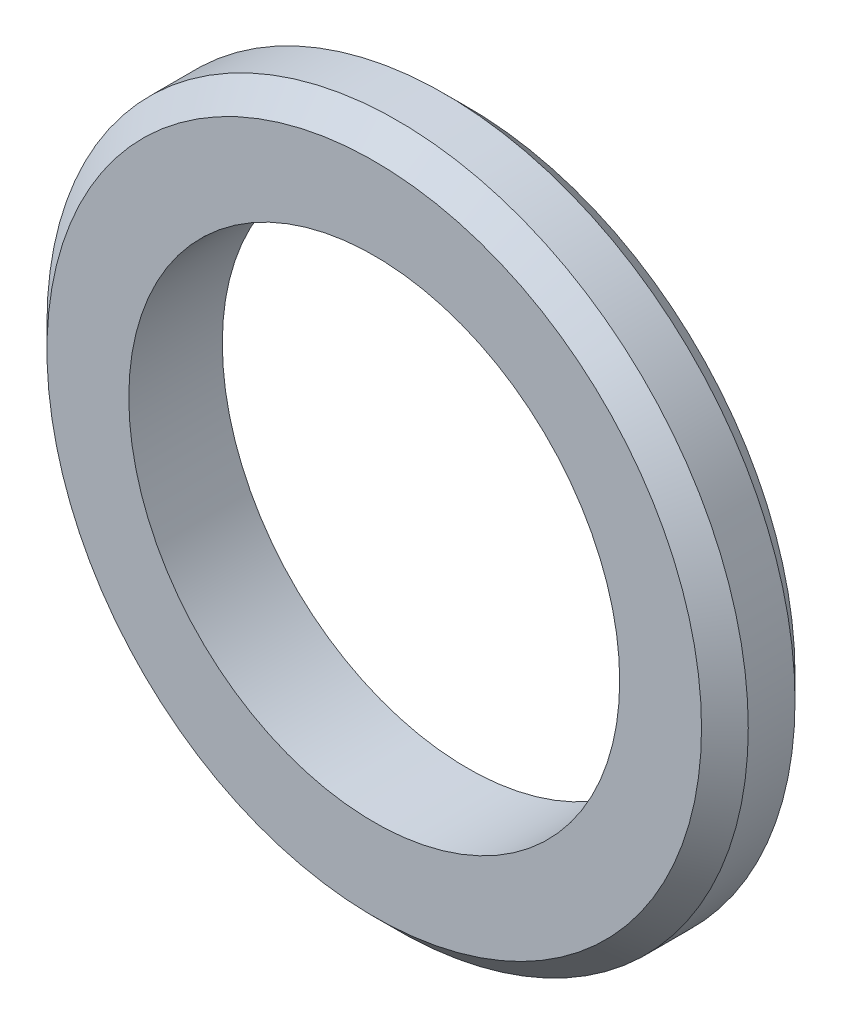
ISO-10303-21;
HEADER;
FILE_DESCRIPTION(('STEP AP214'),'2;1');
FILE_NAME('part.step','',(''),(''),'','','');
FILE_SCHEMA(('AUTOMOTIVE_DESIGN { 1 0 10303 214 1 1 1 1 }'));
ENDSEC;
DATA;
#1=APPLICATION_CONTEXT('core data for automotive mechanical design processes');
#2=APPLICATION_PROTOCOL_DEFINITION('international standard','automotive_design',2000,#1);
#3=PRODUCT_CONTEXT('',#1,'mechanical');
#4=PRODUCT('Part','Part','',(#3));
#5=PRODUCT_RELATED_PRODUCT_CATEGORY('part','',(#4));
#6=PRODUCT_DEFINITION_FORMATION('','',#4);
#7=PRODUCT_DEFINITION_CONTEXT('part definition',#1,'design');
#8=PRODUCT_DEFINITION('design','',#6,#7);
#9=PRODUCT_DEFINITION_SHAPE('','',#8);
#10=(LENGTH_UNIT() NAMED_UNIT(*) SI_UNIT(.MILLI.,.METRE.));
#11=(NAMED_UNIT(*) PLANE_ANGLE_UNIT() SI_UNIT($,.RADIAN.));
#12=(NAMED_UNIT(*) SI_UNIT($,.STERADIAN.) SOLID_ANGLE_UNIT());
#13=UNCERTAINTY_MEASURE_WITH_UNIT(LENGTH_MEASURE(1.E-05),#10,'distance_accuracy_value','');
#14=(GEOMETRIC_REPRESENTATION_CONTEXT(3) GLOBAL_UNCERTAINTY_ASSIGNED_CONTEXT((#13)) GLOBAL_UNIT_ASSIGNED_CONTEXT((#10,
#11,#12)) REPRESENTATION_CONTEXT('',''));
#15=CARTESIAN_POINT('',(0.,0.,0.));
#16=DIRECTION('',(0.,0.,1.));
#17=DIRECTION('',(1.,0.,0.));
#18=AXIS2_PLACEMENT_3D('',#15,#16,#17);
#19=CARTESIAN_POINT('',(0.,0.,1.));
#20=DIRECTION('',(0.,0.,1.));
#21=DIRECTION('',(1.,0.,0.));
#22=AXIS2_PLACEMENT_3D('',#19,#20,#21);
#23=PLANE('',#22);
#24=CARTESIAN_POINT('',(0.,0.,1.));
#25=DIRECTION('',(0.,0.,1.));
#26=DIRECTION('',(1.,0.,0.));
#27=AXIS2_PLACEMENT_3D('',#24,#25,#26);
#28=CIRCLE('',#27,6.99999999999999);
#29=CARTESIAN_POINT('',(6.99999999999999,0.,1.));
#30=VERTEX_POINT('',#29);
#31=EDGE_CURVE('E10',#30,#30,#28,.T.);
#32=ORIENTED_EDGE('',*,*,#31,.T.);
#33=EDGE_LOOP('',(#32));
#34=FACE_BOUND('',#33,.T.);
#35=CARTESIAN_POINT('',(0.,0.,1.));
#36=DIRECTION('',(0.,0.,1.));
#37=DIRECTION('',(1.,0.,0.));
#38=AXIS2_PLACEMENT_3D('',#35,#36,#37);
#39=CIRCLE('',#38,5.25);
#40=CARTESIAN_POINT('',(5.25,0.,1.));
#41=VERTEX_POINT('',#40);
#42=EDGE_CURVE('E50',#41,#41,#39,.T.);
#43=ORIENTED_EDGE('',*,*,#42,.F.);
#44=EDGE_LOOP('',(#43));
#45=FACE_BOUND('',#44,.T.);
#46=ADVANCED_FACE('F30',(#34,#45),#23,.T.);
#47=CARTESIAN_POINT('',(0.,0.,-1.));
#48=DIRECTION('',(0.,0.,1.));
#49=DIRECTION('',(1.,0.,0.));
#50=AXIS2_PLACEMENT_3D('',#47,#48,#49);
#51=PLANE('',#50);
#52=CARTESIAN_POINT('',(0.,0.,-1.));
#53=DIRECTION('',(0.,0.,1.));
#54=DIRECTION('',(1.,0.,0.));
#55=AXIS2_PLACEMENT_3D('',#52,#53,#54);
#56=CIRCLE('',#55,6.99999999999999);
#57=CARTESIAN_POINT('',(6.99999999999999,0.,-1.));
#58=VERTEX_POINT('',#57);
#59=EDGE_CURVE('E37',#58,#58,#56,.F.);
#60=ORIENTED_EDGE('',*,*,#59,.T.);
#61=EDGE_LOOP('',(#60));
#62=FACE_BOUND('',#61,.T.);
#63=CARTESIAN_POINT('',(0.,0.,-1.));
#64=DIRECTION('',(0.,0.,1.));
#65=DIRECTION('',(1.,0.,0.));
#66=AXIS2_PLACEMENT_3D('',#63,#64,#65);
#67=CIRCLE('',#66,5.25);
#68=CARTESIAN_POINT('',(5.25,0.,-1.));
#69=VERTEX_POINT('',#68);
#70=EDGE_CURVE('E51',#69,#69,#67,.T.);
#71=ORIENTED_EDGE('',*,*,#70,.T.);
#72=EDGE_LOOP('',(#71));
#73=FACE_BOUND('',#72,.T.);
#74=ADVANCED_FACE('F61',(#62,#73),#51,.F.);
#75=CARTESIAN_POINT('',(0.,0.,1.));
#76=DIRECTION('',(0.,0.,-1.));
#77=DIRECTION('',(-1.,0.,0.));
#78=AXIS2_PLACEMENT_3D('',#75,#76,#77);
#79=CYLINDRICAL_SURFACE('',#78,7.5);
#80=CARTESIAN_POINT('',(0.,0.,-0.499999999999997));
#81=DIRECTION('',(0.,0.,1.));
#82=DIRECTION('',(1.,0.,0.));
#83=AXIS2_PLACEMENT_3D('',#80,#81,#82);
#84=CIRCLE('',#83,7.5);
#85=CARTESIAN_POINT('',(7.5,0.,-0.499999999999997));
#86=VERTEX_POINT('',#85);
#87=EDGE_CURVE('E41',#86,#86,#84,.T.);
#88=ORIENTED_EDGE('',*,*,#87,.T.);
#89=EDGE_LOOP('',(#88));
#90=FACE_BOUND('',#89,.T.);
#91=CARTESIAN_POINT('',(0.,0.,0.499999999999993));
#92=DIRECTION('',(0.,0.,1.));
#93=DIRECTION('',(1.,0.,0.));
#94=AXIS2_PLACEMENT_3D('',#91,#92,#93);
#95=CIRCLE('',#94,7.5);
#96=CARTESIAN_POINT('',(7.5,0.,0.499999999999993));
#97=VERTEX_POINT('',#96);
#98=EDGE_CURVE('E45',#97,#97,#95,.F.);
#99=ORIENTED_EDGE('',*,*,#98,.T.);
#100=EDGE_LOOP('',(#99));
#101=FACE_BOUND('',#100,.T.);
#102=ADVANCED_FACE('F66',(#90,#101),#79,.T.);
#103=CARTESIAN_POINT('',(0.,0.,1.));
#104=DIRECTION('',(0.,0.,-1.));
#105=DIRECTION('',(-1.,0.,0.));
#106=AXIS2_PLACEMENT_3D('',#103,#104,#105);
#107=CYLINDRICAL_SURFACE('',#106,5.25);
#108=ORIENTED_EDGE('',*,*,#42,.T.);
#109=EDGE_LOOP('',(#108));
#110=FACE_BOUND('',#109,.T.);
#111=ORIENTED_EDGE('',*,*,#70,.F.);
#112=EDGE_LOOP('',(#111));
#113=FACE_BOUND('',#112,.T.);
#114=ADVANCED_FACE('F57',(#110,#113),#107,.F.);
#115=CARTESIAN_POINT('',(0.,0.,-0.499999999999997));
#116=DIRECTION('',(0.,0.,1.));
#117=DIRECTION('',(1.,0.,0.));
#118=AXIS2_PLACEMENT_3D('',#115,#116,#117);
#119=CONICAL_SURFACE('',#118,7.5,0.78539816339745);
#120=ORIENTED_EDGE('',*,*,#59,.F.);
#121=EDGE_LOOP('',(#120));
#122=FACE_BOUND('',#121,.T.);
#123=ORIENTED_EDGE('',*,*,#87,.F.);
#124=EDGE_LOOP('',(#123));
#125=FACE_BOUND('',#124,.T.);
#126=ADVANCED_FACE('F72',(#122,#125),#119,.T.);
#127=CARTESIAN_POINT('',(0.,0.,1.));
#128=DIRECTION('',(0.,0.,-1.));
#129=DIRECTION('',(-1.,0.,0.));
#130=AXIS2_PLACEMENT_3D('',#127,#128,#129);
#131=CONICAL_SURFACE('',#130,6.99999999999999,0.785398163397446);
#132=ORIENTED_EDGE('',*,*,#98,.F.);
#133=EDGE_LOOP('',(#132));
#134=FACE_BOUND('',#133,.T.);
#135=ORIENTED_EDGE('',*,*,#31,.F.);
#136=EDGE_LOOP('',(#135));
#137=FACE_BOUND('',#136,.T.);
#138=ADVANCED_FACE('F32',(#134,#137),#131,.T.);
#139=CLOSED_SHELL('',(#46,#74,#102,#114,#126,#138));
#140=MANIFOLD_SOLID_BREP('B2',#139);
#141=ADVANCED_BREP_SHAPE_REPRESENTATION('',(#18,#140),#14);
#142=SHAPE_DEFINITION_REPRESENTATION(#9,#141);
ENDSEC;
END-ISO-10303-21;
